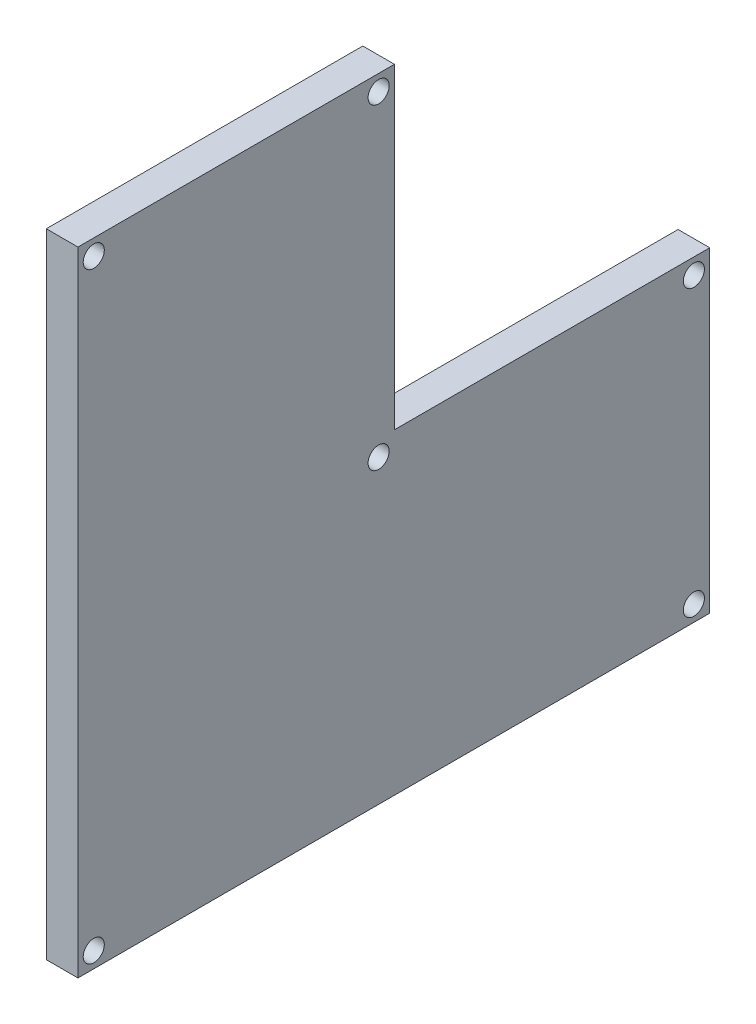
ISO-10303-21;
HEADER;
FILE_DESCRIPTION(('STEP AP214'),'2;1');
FILE_NAME('part.step','',(''),(''),'','','');
FILE_SCHEMA(('AUTOMOTIVE_DESIGN { 1 0 10303 214 1 1 1 1 }'));
ENDSEC;
DATA;
#1=APPLICATION_CONTEXT('core data for automotive mechanical design processes');
#2=APPLICATION_PROTOCOL_DEFINITION('international standard','automotive_design',2000,#1);
#3=PRODUCT_CONTEXT('',#1,'mechanical');
#4=PRODUCT('Part','Part','',(#3));
#5=PRODUCT_RELATED_PRODUCT_CATEGORY('part','',(#4));
#6=PRODUCT_DEFINITION_FORMATION('','',#4);
#7=PRODUCT_DEFINITION_CONTEXT('part definition',#1,'design');
#8=PRODUCT_DEFINITION('design','',#6,#7);
#9=PRODUCT_DEFINITION_SHAPE('','',#8);
#10=(LENGTH_UNIT() NAMED_UNIT(*) SI_UNIT(.MILLI.,.METRE.));
#11=(NAMED_UNIT(*) PLANE_ANGLE_UNIT() SI_UNIT($,.RADIAN.));
#12=(NAMED_UNIT(*) SI_UNIT($,.STERADIAN.) SOLID_ANGLE_UNIT());
#13=UNCERTAINTY_MEASURE_WITH_UNIT(LENGTH_MEASURE(1.E-05),#10,'distance_accuracy_value','');
#14=(GEOMETRIC_REPRESENTATION_CONTEXT(3) GLOBAL_UNCERTAINTY_ASSIGNED_CONTEXT((#13)) GLOBAL_UNIT_ASSIGNED_CONTEXT((#10,
#11,#12)) REPRESENTATION_CONTEXT('',''));
#15=CARTESIAN_POINT('',(0.,0.,0.));
#16=DIRECTION('',(0.,0.,1.));
#17=DIRECTION('',(1.,0.,0.));
#18=AXIS2_PLACEMENT_3D('',#15,#16,#17);
#19=CARTESIAN_POINT('',(3.,0.,-44.6978137651822));
#20=DIRECTION('',(0.,0.,-1.));
#21=DIRECTION('',(0.,1.,0.));
#22=AXIS2_PLACEMENT_3D('',#19,#20,#21);
#23=PLANE('',#22);
#24=DIRECTION('',(0.,-1.,0.));
#25=VECTOR('',#24,1.);
#26=CARTESIAN_POINT('',(0.,0.,-44.6978137651822));
#27=LINE('',#26,#25);
#28=CARTESIAN_POINT('',(0.,-10.6882591093117,-44.6978137651822));
#29=VERTEX_POINT('',#28);
#30=CARTESIAN_POINT('',(0.,-40.6882591093117,-44.6978137651822));
#31=VERTEX_POINT('',#30);
#32=EDGE_CURVE('E116',#29,#31,#27,.T.);
#33=ORIENTED_EDGE('',*,*,#32,.F.);
#34=DIRECTION('',(-1.,0.,0.));
#35=VECTOR('',#34,1.);
#36=CARTESIAN_POINT('',(3.,-10.6882591093117,-44.6978137651822));
#37=LINE('',#36,#35);
#38=CARTESIAN_POINT('',(3.,-10.6882591093117,-44.6978137651822));
#39=VERTEX_POINT('',#38);
#40=EDGE_CURVE('E11',#39,#29,#37,.T.);
#41=ORIENTED_EDGE('',*,*,#40,.F.);
#42=DIRECTION('',(0.,-1.,0.));
#43=VECTOR('',#42,1.);
#44=CARTESIAN_POINT('',(3.,0.,-44.6978137651822));
#45=LINE('',#44,#43);
#46=CARTESIAN_POINT('',(3.,-40.6882591093117,-44.6978137651822));
#47=VERTEX_POINT('',#46);
#48=EDGE_CURVE('E131',#39,#47,#45,.T.);
#49=ORIENTED_EDGE('',*,*,#48,.T.);
#50=DIRECTION('',(-1.,0.,0.));
#51=VECTOR('',#50,1.);
#52=CARTESIAN_POINT('',(3.,-40.6882591093117,-44.6978137651822));
#53=LINE('',#52,#51);
#54=EDGE_CURVE('E79',#47,#31,#53,.T.);
#55=ORIENTED_EDGE('',*,*,#54,.T.);
#56=EDGE_LOOP('',(#33,#41,#49,#55));
#57=FACE_BOUND('',#56,.T.);
#58=ADVANCED_FACE('F35',(#57),#23,.T.);
#59=CARTESIAN_POINT('',(3.,-10.6882591093117,0.));
#60=DIRECTION('',(0.,1.,0.));
#61=DIRECTION('',(0.,0.,1.));
#62=AXIS2_PLACEMENT_3D('',#59,#60,#61);
#63=PLANE('',#62);
#64=DIRECTION('',(0.,0.,-1.));
#65=VECTOR('',#64,1.);
#66=CARTESIAN_POINT('',(0.,-10.6882591093117,0.));
#67=LINE('',#66,#65);
#68=CARTESIAN_POINT('',(0.,-10.6882591093117,-14.8178137651822));
#69=VERTEX_POINT('',#68);
#70=EDGE_CURVE('E119',#69,#29,#67,.T.);
#71=ORIENTED_EDGE('',*,*,#70,.F.);
#72=DIRECTION('',(-1.,0.,0.));
#73=VECTOR('',#72,1.);
#74=CARTESIAN_POINT('',(3.,-10.6882591093117,-14.8178137651822));
#75=LINE('',#74,#73);
#76=CARTESIAN_POINT('',(3.,-10.6882591093117,-14.8178137651822));
#77=VERTEX_POINT('',#76);
#78=EDGE_CURVE('E43',#77,#69,#75,.T.);
#79=ORIENTED_EDGE('',*,*,#78,.F.);
#80=DIRECTION('',(0.,0.,-1.));
#81=VECTOR('',#80,1.);
#82=CARTESIAN_POINT('',(3.,-10.6882591093117,0.));
#83=LINE('',#82,#81);
#84=EDGE_CURVE('E144',#77,#39,#83,.T.);
#85=ORIENTED_EDGE('',*,*,#84,.T.);
#86=ORIENTED_EDGE('',*,*,#40,.T.);
#87=EDGE_LOOP('',(#71,#79,#85,#86));
#88=FACE_BOUND('',#87,.T.);
#89=ADVANCED_FACE('F140',(#88),#63,.T.);
#90=CARTESIAN_POINT('',(3.,0.,-14.8178137651822));
#91=DIRECTION('',(0.,0.,-1.));
#92=DIRECTION('',(0.,1.,0.));
#93=AXIS2_PLACEMENT_3D('',#90,#91,#92);
#94=PLANE('',#93);
#95=DIRECTION('',(0.,-1.,0.));
#96=VECTOR('',#95,1.);
#97=CARTESIAN_POINT('',(0.,0.,-14.8178137651822));
#98=LINE('',#97,#96);
#99=CARTESIAN_POINT('',(0.,19.3117408906883,-14.8178137651822));
#100=VERTEX_POINT('',#99);
#101=EDGE_CURVE('E123',#100,#69,#98,.T.);
#102=ORIENTED_EDGE('',*,*,#101,.F.);
#103=DIRECTION('',(-1.,0.,0.));
#104=VECTOR('',#103,1.);
#105=CARTESIAN_POINT('',(3.,19.3117408906883,-14.8178137651822));
#106=LINE('',#105,#104);
#107=CARTESIAN_POINT('',(3.,19.3117408906883,-14.8178137651822));
#108=VERTEX_POINT('',#107);
#109=EDGE_CURVE('E102',#108,#100,#106,.T.);
#110=ORIENTED_EDGE('',*,*,#109,.F.);
#111=DIRECTION('',(0.,-1.,0.));
#112=VECTOR('',#111,1.);
#113=CARTESIAN_POINT('',(3.,0.,-14.8178137651822));
#114=LINE('',#113,#112);
#115=EDGE_CURVE('E109',#108,#77,#114,.T.);
#116=ORIENTED_EDGE('',*,*,#115,.T.);
#117=ORIENTED_EDGE('',*,*,#78,.T.);
#118=EDGE_LOOP('',(#102,#110,#116,#117));
#119=FACE_BOUND('',#118,.T.);
#120=ADVANCED_FACE('F137',(#119),#94,.T.);
#121=CARTESIAN_POINT('',(3.,19.3117408906883,0.));
#122=DIRECTION('',(0.,1.,0.));
#123=DIRECTION('',(0.,0.,1.));
#124=AXIS2_PLACEMENT_3D('',#121,#122,#123);
#125=PLANE('',#124);
#126=DIRECTION('',(0.,0.,-1.));
#127=VECTOR('',#126,1.);
#128=CARTESIAN_POINT('',(0.,19.3117408906883,0.));
#129=LINE('',#128,#127);
#130=CARTESIAN_POINT('',(0.,19.3117408906883,15.1821862348178));
#131=VERTEX_POINT('',#130);
#132=EDGE_CURVE('E97',#131,#100,#129,.T.);
#133=ORIENTED_EDGE('',*,*,#132,.F.);
#134=DIRECTION('',(-1.,0.,0.));
#135=VECTOR('',#134,1.);
#136=CARTESIAN_POINT('',(3.,19.3117408906883,15.1821862348178));
#137=LINE('',#136,#135);
#138=CARTESIAN_POINT('',(3.,19.3117408906883,15.1821862348178));
#139=VERTEX_POINT('',#138);
#140=EDGE_CURVE('E92',#139,#131,#137,.T.);
#141=ORIENTED_EDGE('',*,*,#140,.F.);
#142=DIRECTION('',(0.,0.,-1.));
#143=VECTOR('',#142,1.);
#144=CARTESIAN_POINT('',(3.,19.3117408906883,0.));
#145=LINE('',#144,#143);
#146=EDGE_CURVE('E95',#139,#108,#145,.T.);
#147=ORIENTED_EDGE('',*,*,#146,.T.);
#148=ORIENTED_EDGE('',*,*,#109,.T.);
#149=EDGE_LOOP('',(#133,#141,#147,#148));
#150=FACE_BOUND('',#149,.T.);
#151=ADVANCED_FACE('F94',(#150),#125,.T.);
#152=CARTESIAN_POINT('',(3.,0.,15.1821862348178));
#153=DIRECTION('',(0.,0.,1.));
#154=DIRECTION('',(0.,-1.,0.));
#155=AXIS2_PLACEMENT_3D('',#152,#153,#154);
#156=PLANE('',#155);
#157=DIRECTION('',(0.,1.,0.));
#158=VECTOR('',#157,1.);
#159=CARTESIAN_POINT('',(0.,0.,15.1821862348178));
#160=LINE('',#159,#158);
#161=CARTESIAN_POINT('',(0.,-40.6882591093118,15.1821862348178));
#162=VERTEX_POINT('',#161);
#163=EDGE_CURVE('E127',#162,#131,#160,.T.);
#164=ORIENTED_EDGE('',*,*,#163,.F.);
#165=DIRECTION('',(-1.,0.,0.));
#166=VECTOR('',#165,1.);
#167=CARTESIAN_POINT('',(3.,-40.6882591093118,15.1821862348178));
#168=LINE('',#167,#166);
#169=CARTESIAN_POINT('',(3.,-40.6882591093118,15.1821862348178));
#170=VERTEX_POINT('',#169);
#171=EDGE_CURVE('E72',#170,#162,#168,.T.);
#172=ORIENTED_EDGE('',*,*,#171,.F.);
#173=DIRECTION('',(0.,1.,0.));
#174=VECTOR('',#173,1.);
#175=CARTESIAN_POINT('',(3.,0.,15.1821862348178));
#176=LINE('',#175,#174);
#177=EDGE_CURVE('E106',#170,#139,#176,.T.);
#178=ORIENTED_EDGE('',*,*,#177,.T.);
#179=ORIENTED_EDGE('',*,*,#140,.T.);
#180=EDGE_LOOP('',(#164,#172,#178,#179));
#181=FACE_BOUND('',#180,.T.);
#182=ADVANCED_FACE('F111',(#181),#156,.T.);
#183=CARTESIAN_POINT('',(3.,-40.6882591093117,0.));
#184=DIRECTION('',(0.,1.,0.));
#185=DIRECTION('',(0.,0.,1.));
#186=AXIS2_PLACEMENT_3D('',#183,#184,#185);
#187=PLANE('',#186);
#188=DIRECTION('',(0.,0.,-1.));
#189=VECTOR('',#188,1.);
#190=CARTESIAN_POINT('',(0.,-40.6882591093117,0.));
#191=LINE('',#190,#189);
#192=EDGE_CURVE('E129',#162,#31,#191,.T.);
#193=ORIENTED_EDGE('',*,*,#192,.T.);
#194=ORIENTED_EDGE('',*,*,#54,.F.);
#195=DIRECTION('',(0.,0.,-1.));
#196=VECTOR('',#195,1.);
#197=CARTESIAN_POINT('',(3.,-40.6882591093117,0.));
#198=LINE('',#197,#196);
#199=EDGE_CURVE('E51',#170,#47,#198,.T.);
#200=ORIENTED_EDGE('',*,*,#199,.F.);
#201=ORIENTED_EDGE('',*,*,#171,.T.);
#202=EDGE_LOOP('',(#193,#194,#200,#201));
#203=FACE_BOUND('',#202,.T.);
#204=ADVANCED_FACE('F143',(#203),#187,.F.);
#205=CARTESIAN_POINT('',(3.,0.,0.));
#206=DIRECTION('',(1.,0.,0.));
#207=DIRECTION('',(0.,0.,-1.));
#208=AXIS2_PLACEMENT_3D('',#205,#206,#207);
#209=PLANE('',#208);
#210=CARTESIAN_POINT('',(3.,-39.1882591093118,13.6821862348178));
#211=DIRECTION('',(-1.,0.,0.));
#212=DIRECTION('',(0.,0.,1.));
#213=AXIS2_PLACEMENT_3D('',#210,#211,#212);
#214=CIRCLE('',#213,1.);
#215=CARTESIAN_POINT('',(3.,-39.1882591093118,14.6821862348178));
#216=VERTEX_POINT('',#215);
#217=EDGE_CURVE('E157',#216,#216,#214,.T.);
#218=ORIENTED_EDGE('',*,*,#217,.T.);
#219=EDGE_LOOP('',(#218));
#220=FACE_BOUND('',#219,.T.);
#221=CARTESIAN_POINT('',(3.,17.8117408906883,13.6821862348178));
#222=DIRECTION('',(-1.,0.,0.));
#223=DIRECTION('',(0.,0.,1.));
#224=AXIS2_PLACEMENT_3D('',#221,#222,#223);
#225=CIRCLE('',#224,1.);
#226=CARTESIAN_POINT('',(3.,17.8117408906883,14.6821862348178));
#227=VERTEX_POINT('',#226);
#228=EDGE_CURVE('E163',#227,#227,#225,.T.);
#229=ORIENTED_EDGE('',*,*,#228,.T.);
#230=EDGE_LOOP('',(#229));
#231=FACE_BOUND('',#230,.T.);
#232=CARTESIAN_POINT('',(3.,17.8117408906883,-13.3178137651822));
#233=DIRECTION('',(-1.,0.,0.));
#234=DIRECTION('',(0.,0.,1.));
#235=AXIS2_PLACEMENT_3D('',#232,#233,#234);
#236=CIRCLE('',#235,1.);
#237=CARTESIAN_POINT('',(3.,17.8117408906883,-12.3178137651822));
#238=VERTEX_POINT('',#237);
#239=EDGE_CURVE('E169',#238,#238,#236,.T.);
#240=ORIENTED_EDGE('',*,*,#239,.T.);
#241=EDGE_LOOP('',(#240));
#242=FACE_BOUND('',#241,.T.);
#243=CARTESIAN_POINT('',(3.,-12.1882591093117,-13.3178137651822));
#244=DIRECTION('',(-1.,0.,0.));
#245=DIRECTION('',(0.,0.,1.));
#246=AXIS2_PLACEMENT_3D('',#243,#244,#245);
#247=CIRCLE('',#246,1.);
#248=CARTESIAN_POINT('',(3.,-12.1882591093117,-12.3178137651822));
#249=VERTEX_POINT('',#248);
#250=EDGE_CURVE('E175',#249,#249,#247,.T.);
#251=ORIENTED_EDGE('',*,*,#250,.T.);
#252=EDGE_LOOP('',(#251));
#253=FACE_BOUND('',#252,.T.);
#254=CARTESIAN_POINT('',(3.,-12.1882591093117,-43.1978137651822));
#255=DIRECTION('',(-1.,0.,0.));
#256=DIRECTION('',(0.,0.,1.));
#257=AXIS2_PLACEMENT_3D('',#254,#255,#256);
#258=CIRCLE('',#257,0.999999999999998);
#259=CARTESIAN_POINT('',(3.,-12.1882591093117,-42.1978137651822));
#260=VERTEX_POINT('',#259);
#261=EDGE_CURVE('E151',#260,#260,#258,.T.);
#262=ORIENTED_EDGE('',*,*,#261,.T.);
#263=EDGE_LOOP('',(#262));
#264=FACE_BOUND('',#263,.T.);
#265=CARTESIAN_POINT('',(3.,-39.1882591093117,-43.1978137651822));
#266=DIRECTION('',(-1.,0.,0.));
#267=DIRECTION('',(0.,0.,1.));
#268=AXIS2_PLACEMENT_3D('',#265,#266,#267);
#269=CIRCLE('',#268,0.999999999999998);
#270=CARTESIAN_POINT('',(3.,-39.1882591093117,-42.1978137651822));
#271=VERTEX_POINT('',#270);
#272=EDGE_CURVE('E120',#271,#271,#269,.T.);
#273=ORIENTED_EDGE('',*,*,#272,.T.);
#274=EDGE_LOOP('',(#273));
#275=FACE_BOUND('',#274,.T.);
#276=ORIENTED_EDGE('',*,*,#48,.F.);
#277=ORIENTED_EDGE('',*,*,#84,.F.);
#278=ORIENTED_EDGE('',*,*,#115,.F.);
#279=ORIENTED_EDGE('',*,*,#146,.F.);
#280=ORIENTED_EDGE('',*,*,#177,.F.);
#281=ORIENTED_EDGE('',*,*,#199,.T.);
#282=EDGE_LOOP('',(#276,#277,#278,#279,#280,#281));
#283=FACE_BOUND('',#282,.T.);
#284=ADVANCED_FACE('F105',(#220,#231,#242,#253,#264,#275,#283),#209,.T.);
#285=CARTESIAN_POINT('',(0.,0.,0.));
#286=DIRECTION('',(1.,0.,0.));
#287=DIRECTION('',(0.,0.,-1.));
#288=AXIS2_PLACEMENT_3D('',#285,#286,#287);
#289=PLANE('',#288);
#290=CARTESIAN_POINT('',(0.,-39.1882591093118,13.6821862348178));
#291=DIRECTION('',(-1.,0.,0.));
#292=DIRECTION('',(0.,0.,1.));
#293=AXIS2_PLACEMENT_3D('',#290,#291,#292);
#294=CIRCLE('',#293,1.);
#295=CARTESIAN_POINT('',(0.,-39.1882591093118,14.6821862348178));
#296=VERTEX_POINT('',#295);
#297=EDGE_CURVE('E154',#296,#296,#294,.T.);
#298=ORIENTED_EDGE('',*,*,#297,.F.);
#299=EDGE_LOOP('',(#298));
#300=FACE_BOUND('',#299,.T.);
#301=CARTESIAN_POINT('',(0.,17.8117408906883,13.6821862348178));
#302=DIRECTION('',(-1.,0.,0.));
#303=DIRECTION('',(0.,0.,1.));
#304=AXIS2_PLACEMENT_3D('',#301,#302,#303);
#305=CIRCLE('',#304,1.);
#306=CARTESIAN_POINT('',(0.,17.8117408906883,14.6821862348178));
#307=VERTEX_POINT('',#306);
#308=EDGE_CURVE('E160',#307,#307,#305,.T.);
#309=ORIENTED_EDGE('',*,*,#308,.F.);
#310=EDGE_LOOP('',(#309));
#311=FACE_BOUND('',#310,.T.);
#312=CARTESIAN_POINT('',(0.,17.8117408906883,-13.3178137651822));
#313=DIRECTION('',(-1.,0.,0.));
#314=DIRECTION('',(0.,0.,1.));
#315=AXIS2_PLACEMENT_3D('',#312,#313,#314);
#316=CIRCLE('',#315,1.);
#317=CARTESIAN_POINT('',(0.,17.8117408906883,-12.3178137651822));
#318=VERTEX_POINT('',#317);
#319=EDGE_CURVE('E166',#318,#318,#316,.T.);
#320=ORIENTED_EDGE('',*,*,#319,.F.);
#321=EDGE_LOOP('',(#320));
#322=FACE_BOUND('',#321,.T.);
#323=CARTESIAN_POINT('',(0.,-12.1882591093117,-13.3178137651822));
#324=DIRECTION('',(-1.,0.,0.));
#325=DIRECTION('',(0.,0.,1.));
#326=AXIS2_PLACEMENT_3D('',#323,#324,#325);
#327=CIRCLE('',#326,1.);
#328=CARTESIAN_POINT('',(0.,-12.1882591093117,-12.3178137651822));
#329=VERTEX_POINT('',#328);
#330=EDGE_CURVE('E172',#329,#329,#327,.T.);
#331=ORIENTED_EDGE('',*,*,#330,.F.);
#332=EDGE_LOOP('',(#331));
#333=FACE_BOUND('',#332,.T.);
#334=CARTESIAN_POINT('',(0.,-12.1882591093117,-43.1978137651822));
#335=DIRECTION('',(-1.,0.,0.));
#336=DIRECTION('',(0.,0.,1.));
#337=AXIS2_PLACEMENT_3D('',#334,#335,#336);
#338=CIRCLE('',#337,0.999999999999998);
#339=CARTESIAN_POINT('',(0.,-12.1882591093117,-42.1978137651822));
#340=VERTEX_POINT('',#339);
#341=EDGE_CURVE('E178',#340,#340,#338,.T.);
#342=ORIENTED_EDGE('',*,*,#341,.F.);
#343=EDGE_LOOP('',(#342));
#344=FACE_BOUND('',#343,.T.);
#345=CARTESIAN_POINT('',(0.,-39.1882591093117,-43.1978137651822));
#346=DIRECTION('',(-1.,0.,0.));
#347=DIRECTION('',(0.,0.,1.));
#348=AXIS2_PLACEMENT_3D('',#345,#346,#347);
#349=CIRCLE('',#348,0.999999999999998);
#350=CARTESIAN_POINT('',(0.,-39.1882591093117,-42.1978137651822));
#351=VERTEX_POINT('',#350);
#352=EDGE_CURVE('E148',#351,#351,#349,.T.);
#353=ORIENTED_EDGE('',*,*,#352,.F.);
#354=EDGE_LOOP('',(#353));
#355=FACE_BOUND('',#354,.T.);
#356=ORIENTED_EDGE('',*,*,#32,.T.);
#357=ORIENTED_EDGE('',*,*,#192,.F.);
#358=ORIENTED_EDGE('',*,*,#163,.T.);
#359=ORIENTED_EDGE('',*,*,#132,.T.);
#360=ORIENTED_EDGE('',*,*,#101,.T.);
#361=ORIENTED_EDGE('',*,*,#70,.T.);
#362=EDGE_LOOP('',(#356,#357,#358,#359,#360,#361));
#363=FACE_BOUND('',#362,.T.);
#364=ADVANCED_FACE('F142',(#300,#311,#322,#333,#344,#355,#363),#289,.F.);
#365=CARTESIAN_POINT('',(3.,-39.1882591093117,-43.1978137651822));
#366=DIRECTION('',(-1.,0.,0.));
#367=DIRECTION('',(0.,0.,1.));
#368=AXIS2_PLACEMENT_3D('',#365,#366,#367);
#369=CYLINDRICAL_SURFACE('',#368,0.999999999999998);
#370=ORIENTED_EDGE('',*,*,#272,.F.);
#371=EDGE_LOOP('',(#370));
#372=FACE_BOUND('',#371,.T.);
#373=ORIENTED_EDGE('',*,*,#352,.T.);
#374=EDGE_LOOP('',(#373));
#375=FACE_BOUND('',#374,.T.);
#376=ADVANCED_FACE('F190',(#372,#375),#369,.F.);
#377=CARTESIAN_POINT('',(3.,-12.1882591093117,-43.1978137651822));
#378=DIRECTION('',(-1.,0.,0.));
#379=DIRECTION('',(0.,0.,1.));
#380=AXIS2_PLACEMENT_3D('',#377,#378,#379);
#381=CYLINDRICAL_SURFACE('',#380,0.999999999999998);
#382=ORIENTED_EDGE('',*,*,#261,.F.);
#383=EDGE_LOOP('',(#382));
#384=FACE_BOUND('',#383,.T.);
#385=ORIENTED_EDGE('',*,*,#341,.T.);
#386=EDGE_LOOP('',(#385));
#387=FACE_BOUND('',#386,.T.);
#388=ADVANCED_FACE('F186',(#384,#387),#381,.F.);
#389=CARTESIAN_POINT('',(3.,-12.1882591093117,-13.3178137651822));
#390=DIRECTION('',(-1.,0.,0.));
#391=DIRECTION('',(0.,0.,1.));
#392=AXIS2_PLACEMENT_3D('',#389,#390,#391);
#393=CYLINDRICAL_SURFACE('',#392,1.);
#394=ORIENTED_EDGE('',*,*,#250,.F.);
#395=EDGE_LOOP('',(#394));
#396=FACE_BOUND('',#395,.T.);
#397=ORIENTED_EDGE('',*,*,#330,.T.);
#398=EDGE_LOOP('',(#397));
#399=FACE_BOUND('',#398,.T.);
#400=ADVANCED_FACE('F189',(#396,#399),#393,.F.);
#401=CARTESIAN_POINT('',(3.,17.8117408906883,-13.3178137651822));
#402=DIRECTION('',(-1.,0.,0.));
#403=DIRECTION('',(0.,0.,1.));
#404=AXIS2_PLACEMENT_3D('',#401,#402,#403);
#405=CYLINDRICAL_SURFACE('',#404,1.);
#406=ORIENTED_EDGE('',*,*,#239,.F.);
#407=EDGE_LOOP('',(#406));
#408=FACE_BOUND('',#407,.T.);
#409=ORIENTED_EDGE('',*,*,#319,.T.);
#410=EDGE_LOOP('',(#409));
#411=FACE_BOUND('',#410,.T.);
#412=ADVANCED_FACE('F236',(#408,#411),#405,.F.);
#413=CARTESIAN_POINT('',(3.,17.8117408906883,13.6821862348178));
#414=DIRECTION('',(-1.,0.,0.));
#415=DIRECTION('',(0.,0.,1.));
#416=AXIS2_PLACEMENT_3D('',#413,#414,#415);
#417=CYLINDRICAL_SURFACE('',#416,1.);
#418=ORIENTED_EDGE('',*,*,#228,.F.);
#419=EDGE_LOOP('',(#418));
#420=FACE_BOUND('',#419,.T.);
#421=ORIENTED_EDGE('',*,*,#308,.T.);
#422=EDGE_LOOP('',(#421));
#423=FACE_BOUND('',#422,.T.);
#424=ADVANCED_FACE('F243',(#420,#423),#417,.F.);
#425=CARTESIAN_POINT('',(3.,-39.1882591093118,13.6821862348178));
#426=DIRECTION('',(-1.,0.,0.));
#427=DIRECTION('',(0.,0.,1.));
#428=AXIS2_PLACEMENT_3D('',#425,#426,#427);
#429=CYLINDRICAL_SURFACE('',#428,1.);
#430=ORIENTED_EDGE('',*,*,#217,.F.);
#431=EDGE_LOOP('',(#430));
#432=FACE_BOUND('',#431,.T.);
#433=ORIENTED_EDGE('',*,*,#297,.T.);
#434=EDGE_LOOP('',(#433));
#435=FACE_BOUND('',#434,.T.);
#436=ADVANCED_FACE('F248',(#432,#435),#429,.F.);
#437=CLOSED_SHELL('',(#58,#89,#120,#151,#182,#204,#284,#364,#376,#388,#400,#412,#424,#436));
#438=MANIFOLD_SOLID_BREP('B2',#437);
#439=ADVANCED_BREP_SHAPE_REPRESENTATION('',(#18,#438),#14);
#440=SHAPE_DEFINITION_REPRESENTATION(#9,#439);
ENDSEC;
END-ISO-10303-21;
